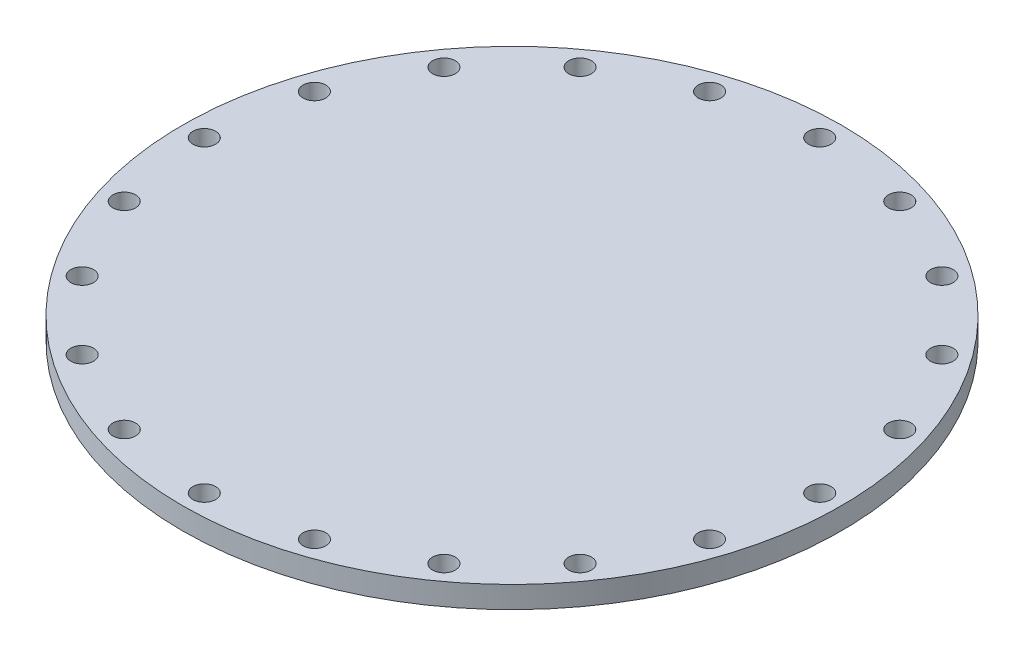
ISO-10303-21;
HEADER;
FILE_DESCRIPTION(('STEP AP214'),'2;1');
FILE_NAME('part.step','',(''),(''),'','','');
FILE_SCHEMA(('AUTOMOTIVE_DESIGN { 1 0 10303 214 1 1 1 1 }'));
ENDSEC;
DATA;
#1=APPLICATION_CONTEXT('core data for automotive mechanical design processes');
#2=APPLICATION_PROTOCOL_DEFINITION('international standard','automotive_design',2000,#1);
#3=PRODUCT_CONTEXT('',#1,'mechanical');
#4=PRODUCT('Part','Part','',(#3));
#5=PRODUCT_RELATED_PRODUCT_CATEGORY('part','',(#4));
#6=PRODUCT_DEFINITION_FORMATION('','',#4);
#7=PRODUCT_DEFINITION_CONTEXT('part definition',#1,'design');
#8=PRODUCT_DEFINITION('design','',#6,#7);
#9=PRODUCT_DEFINITION_SHAPE('','',#8);
#10=(LENGTH_UNIT() NAMED_UNIT(*) SI_UNIT(.MILLI.,.METRE.));
#11=(NAMED_UNIT(*) PLANE_ANGLE_UNIT() SI_UNIT($,.RADIAN.));
#12=(NAMED_UNIT(*) SI_UNIT($,.STERADIAN.) SOLID_ANGLE_UNIT());
#13=UNCERTAINTY_MEASURE_WITH_UNIT(LENGTH_MEASURE(1.E-05),#10,'distance_accuracy_value','');
#14=(GEOMETRIC_REPRESENTATION_CONTEXT(3) GLOBAL_UNCERTAINTY_ASSIGNED_CONTEXT((#13)) GLOBAL_UNIT_ASSIGNED_CONTEXT((#10,
#11,#12)) REPRESENTATION_CONTEXT('',''));
#15=CARTESIAN_POINT('',(0.,0.,0.));
#16=DIRECTION('',(0.,0.,1.));
#17=DIRECTION('',(1.,0.,0.));
#18=AXIS2_PLACEMENT_3D('',#15,#16,#17);
#19=CARTESIAN_POINT('',(0.,12.5,0.));
#20=DIRECTION('',(0.,1.,0.));
#21=DIRECTION('',(0.,0.,1.));
#22=AXIS2_PLACEMENT_3D('',#19,#20,#21);
#23=PLANE('',#22);
#24=CARTESIAN_POINT('',(-207.194301433094,12.5,-285.17849051716));
#25=DIRECTION('',(0.,1.,0.));
#26=DIRECTION('',(0.,0.,1.));
#27=AXIS2_PLACEMENT_3D('',#24,#25,#26);
#28=CIRCLE('',#27,13.0000000000098);
#29=CARTESIAN_POINT('',(-207.194301433094,12.5,-272.17849051715));
#30=VERTEX_POINT('',#29);
#31=EDGE_CURVE('E149',#30,#30,#28,.T.);
#32=ORIENTED_EDGE('',*,*,#31,.F.);
#33=EDGE_LOOP('',(#32));
#34=FACE_BOUND('',#33,.T.);
#35=CARTESIAN_POINT('',(-335.247421994031,12.5,-108.928490517155));
#36=DIRECTION('',(0.,1.,0.));
#37=DIRECTION('',(0.,0.,1.));
#38=AXIS2_PLACEMENT_3D('',#35,#36,#37);
#39=CIRCLE('',#38,13.0000000000179);
#40=CARTESIAN_POINT('',(-335.247421994031,12.5,-95.9284905171368));
#41=VERTEX_POINT('',#40);
#42=EDGE_CURVE('E137',#41,#41,#39,.T.);
#43=ORIENTED_EDGE('',*,*,#42,.F.);
#44=EDGE_LOOP('',(#43));
#45=FACE_BOUND('',#44,.T.);
#46=CARTESIAN_POINT('',(-335.247421994022,12.5,108.928490517183));
#47=DIRECTION('',(0.,1.,0.));
#48=DIRECTION('',(0.,0.,1.));
#49=AXIS2_PLACEMENT_3D('',#46,#47,#48);
#50=CIRCLE('',#49,13.0000000000261);
#51=CARTESIAN_POINT('',(-335.247421994022,12.5,121.928490517209));
#52=VERTEX_POINT('',#51);
#53=EDGE_CURVE('E125',#52,#52,#50,.T.);
#54=ORIENTED_EDGE('',*,*,#53,.F.);
#55=EDGE_LOOP('',(#54));
#56=FACE_BOUND('',#55,.T.);
#57=CARTESIAN_POINT('',(-207.19430143307,12.5,285.178490517178));
#58=DIRECTION('',(0.,1.,0.));
#59=DIRECTION('',(0.,0.,1.));
#60=AXIS2_PLACEMENT_3D('',#57,#58,#59);
#61=CIRCLE('',#60,13.0000000000314);
#62=CARTESIAN_POINT('',(-207.19430143307,12.5,298.178490517209));
#63=VERTEX_POINT('',#62);
#64=EDGE_CURVE('E113',#63,#63,#61,.T.);
#65=ORIENTED_EDGE('',*,*,#64,.F.);
#66=EDGE_LOOP('',(#65));
#67=FACE_BOUND('',#66,.T.);
#68=CARTESIAN_POINT('',(2.99264513236424E-11,12.5,352.5));
#69=DIRECTION('',(0.,1.,0.));
#70=DIRECTION('',(0.,0.,1.));
#71=AXIS2_PLACEMENT_3D('',#68,#69,#70);
#72=CIRCLE('',#71,13.000000000031);
#73=CARTESIAN_POINT('',(2.99264513236424E-11,12.5,365.500000000031));
#74=VERTEX_POINT('',#73);
#75=EDGE_CURVE('E101',#74,#74,#72,.T.);
#76=ORIENTED_EDGE('',*,*,#75,.F.);
#77=EDGE_LOOP('',(#76));
#78=FACE_BOUND('',#77,.T.);
#79=CARTESIAN_POINT('',(207.194301433124,12.5,285.17849051716));
#80=DIRECTION('',(0.,1.,0.));
#81=DIRECTION('',(0.,0.,1.));
#82=AXIS2_PLACEMENT_3D('',#79,#80,#81);
#83=CIRCLE('',#82,13.0000000000252);
#84=CARTESIAN_POINT('',(207.194301433124,12.5,298.178490517185));
#85=VERTEX_POINT('',#84);
#86=EDGE_CURVE('E89',#85,#85,#83,.T.);
#87=ORIENTED_EDGE('',*,*,#86,.F.);
#88=EDGE_LOOP('',(#87));
#89=FACE_BOUND('',#88,.T.);
#90=CARTESIAN_POINT('',(335.247421994061,12.5,108.928490517155));
#91=DIRECTION('',(0.,1.,0.));
#92=DIRECTION('',(0.,0.,1.));
#93=AXIS2_PLACEMENT_3D('',#90,#91,#92);
#94=CIRCLE('',#93,13.0000000000161);
#95=CARTESIAN_POINT('',(335.247421994061,12.5,121.928490517171));
#96=VERTEX_POINT('',#95);
#97=EDGE_CURVE('E77',#96,#96,#94,.T.);
#98=ORIENTED_EDGE('',*,*,#97,.F.);
#99=EDGE_LOOP('',(#98));
#100=FACE_BOUND('',#99,.T.);
#101=CARTESIAN_POINT('',(335.247421994052,12.5,-108.928490517183));
#102=DIRECTION('',(0.,1.,0.));
#103=DIRECTION('',(0.,0.,1.));
#104=AXIS2_PLACEMENT_3D('',#101,#102,#103);
#105=CIRCLE('',#104,13.0000000000067);
#106=CARTESIAN_POINT('',(335.247421994052,12.5,-95.9284905171764));
#107=VERTEX_POINT('',#106);
#108=EDGE_CURVE('E65',#107,#107,#105,.T.);
#109=ORIENTED_EDGE('',*,*,#108,.F.);
#110=EDGE_LOOP('',(#109));
#111=FACE_BOUND('',#110,.T.);
#112=CARTESIAN_POINT('',(207.1943014331,12.5,-285.178490517178));
#113=DIRECTION('',(0.,1.,0.));
#114=DIRECTION('',(0.,0.,1.));
#115=AXIS2_PLACEMENT_3D('',#112,#113,#114);
#116=CIRCLE('',#115,13.0000000000007);
#117=CARTESIAN_POINT('',(207.1943014331,12.5,-272.178490517177));
#118=VERTEX_POINT('',#117);
#119=EDGE_CURVE('E53',#118,#118,#116,.T.);
#120=ORIENTED_EDGE('',*,*,#119,.F.);
#121=EDGE_LOOP('',(#120));
#122=FACE_BOUND('',#121,.T.);
#123=CARTESIAN_POINT('',(0.,12.5,-352.5));
#124=DIRECTION('',(0.,1.,0.));
#125=DIRECTION('',(0.,0.,1.));
#126=AXIS2_PLACEMENT_3D('',#123,#124,#125);
#127=CIRCLE('',#126,13.);
#128=CARTESIAN_POINT('',(0.,12.5,-339.5));
#129=VERTEX_POINT('',#128);
#130=EDGE_CURVE('E42',#129,#129,#127,.T.);
#131=ORIENTED_EDGE('',*,*,#130,.F.);
#132=EDGE_LOOP('',(#131));
#133=FACE_BOUND('',#132,.T.);
#134=CARTESIAN_POINT('',(0.,12.5,0.));
#135=DIRECTION('',(0.,1.,0.));
#136=DIRECTION('',(0.,0.,1.));
#137=AXIS2_PLACEMENT_3D('',#134,#135,#136);
#138=CIRCLE('',#137,377.5);
#139=CARTESIAN_POINT('',(0.,12.5,377.5));
#140=VERTEX_POINT('',#139);
#141=EDGE_CURVE('E10',#140,#140,#138,.T.);
#142=ORIENTED_EDGE('',*,*,#141,.T.);
#143=EDGE_LOOP('',(#142));
#144=FACE_BOUND('',#143,.T.);
#145=CARTESIAN_POINT('',(108.928490517169,12.5,-335.247421994042));
#146=DIRECTION('',(0.,1.,0.));
#147=DIRECTION('',(0.,0.,1.));
#148=AXIS2_PLACEMENT_3D('',#145,#146,#147);
#149=CIRCLE('',#148,13.);
#150=CARTESIAN_POINT('',(108.928490517169,12.5,-322.247421994042));
#151=VERTEX_POINT('',#150);
#152=EDGE_CURVE('E47',#151,#151,#149,.T.);
#153=ORIENTED_EDGE('',*,*,#152,.F.);
#154=EDGE_LOOP('',(#153));
#155=FACE_BOUND('',#154,.T.);
#156=CARTESIAN_POINT('',(285.178490517175,12.5,-207.194301433109));
#157=DIRECTION('',(0.,1.,0.));
#158=DIRECTION('',(0.,0.,1.));
#159=AXIS2_PLACEMENT_3D('',#156,#157,#158);
#160=CIRCLE('',#159,13.0000000000031);
#161=CARTESIAN_POINT('',(285.178490517175,12.5,-194.194301433106));
#162=VERTEX_POINT('',#161);
#163=EDGE_CURVE('E59',#162,#162,#160,.T.);
#164=ORIENTED_EDGE('',*,*,#163,.F.);
#165=EDGE_LOOP('',(#164));
#166=FACE_BOUND('',#165,.T.);
#167=CARTESIAN_POINT('',(352.500000000015,12.5,-1.49632256618212E-11));
#168=DIRECTION('',(0.,1.,0.));
#169=DIRECTION('',(0.,0.,1.));
#170=AXIS2_PLACEMENT_3D('',#167,#168,#169);
#171=CIRCLE('',#170,13.0000000000111);
#172=CARTESIAN_POINT('',(352.500000000015,12.5,12.9999999999962));
#173=VERTEX_POINT('',#172);
#174=EDGE_CURVE('E71',#173,#173,#171,.T.);
#175=ORIENTED_EDGE('',*,*,#174,.F.);
#176=EDGE_LOOP('',(#175));
#177=FACE_BOUND('',#176,.T.);
#178=CARTESIAN_POINT('',(285.178490517193,12.5,207.194301433085));
#179=DIRECTION('',(0.,1.,0.));
#180=DIRECTION('',(0.,0.,1.));
#181=AXIS2_PLACEMENT_3D('',#178,#179,#180);
#182=CIRCLE('',#181,13.0000000000207);
#183=CARTESIAN_POINT('',(285.178490517193,12.5,220.194301433105));
#184=VERTEX_POINT('',#183);
#185=EDGE_CURVE('E83',#184,#184,#182,.T.);
#186=ORIENTED_EDGE('',*,*,#185,.F.);
#187=EDGE_LOOP('',(#186));
#188=FACE_BOUND('',#187,.T.);
#189=CARTESIAN_POINT('',(108.928490517198,12.5,335.247421994037));
#190=DIRECTION('',(0.,1.,0.));
#191=DIRECTION('',(0.,0.,1.));
#192=AXIS2_PLACEMENT_3D('',#189,#190,#191);
#193=CIRCLE('',#192,13.0000000000288);
#194=CARTESIAN_POINT('',(108.928490517198,12.5,348.247421994066));
#195=VERTEX_POINT('',#194);
#196=EDGE_CURVE('E95',#195,#195,#193,.T.);
#197=ORIENTED_EDGE('',*,*,#196,.F.);
#198=EDGE_LOOP('',(#197));
#199=FACE_BOUND('',#198,.T.);
#200=CARTESIAN_POINT('',(-108.92849051714,12.5,335.247421994046));
#201=DIRECTION('',(0.,1.,0.));
#202=DIRECTION('',(0.,0.,1.));
#203=AXIS2_PLACEMENT_3D('',#200,#201,#202);
#204=CIRCLE('',#203,13.0000000000319);
#205=CARTESIAN_POINT('',(-108.92849051714,12.5,348.247421994078));
#206=VERTEX_POINT('',#205);
#207=EDGE_CURVE('E107',#206,#206,#204,.T.);
#208=ORIENTED_EDGE('',*,*,#207,.F.);
#209=EDGE_LOOP('',(#208));
#210=FACE_BOUND('',#209,.T.);
#211=CARTESIAN_POINT('',(-285.178490517145,12.5,207.194301433109));
#212=DIRECTION('',(0.,1.,0.));
#213=DIRECTION('',(0.,0.,1.));
#214=AXIS2_PLACEMENT_3D('',#211,#212,#213);
#215=CIRCLE('',#214,13.0000000000296);
#216=CARTESIAN_POINT('',(-285.178490517145,12.5,220.194301433138));
#217=VERTEX_POINT('',#216);
#218=EDGE_CURVE('E119',#217,#217,#215,.T.);
#219=ORIENTED_EDGE('',*,*,#218,.F.);
#220=EDGE_LOOP('',(#219));
#221=FACE_BOUND('',#220,.T.);
#222=CARTESIAN_POINT('',(-352.499999999985,12.5,1.50063944614911E-11));
#223=DIRECTION('',(0.,1.,0.));
#224=DIRECTION('',(0.,0.,1.));
#225=AXIS2_PLACEMENT_3D('',#222,#223,#224);
#226=CIRCLE('',#225,13.0000000000223);
#227=CARTESIAN_POINT('',(-352.499999999985,12.5,13.0000000000373));
#228=VERTEX_POINT('',#227);
#229=EDGE_CURVE('E131',#228,#228,#226,.T.);
#230=ORIENTED_EDGE('',*,*,#229,.F.);
#231=EDGE_LOOP('',(#230));
#232=FACE_BOUND('',#231,.T.);
#233=CARTESIAN_POINT('',(-285.178490517163,12.5,-207.194301433085));
#234=DIRECTION('',(0.,1.,0.));
#235=DIRECTION('',(0.,0.,1.));
#236=AXIS2_PLACEMENT_3D('',#233,#234,#235);
#237=CIRCLE('',#236,13.0000000000136);
#238=CARTESIAN_POINT('',(-285.178490517163,12.5,-194.194301433071));
#239=VERTEX_POINT('',#238);
#240=EDGE_CURVE('E143',#239,#239,#237,.T.);
#241=ORIENTED_EDGE('',*,*,#240,.F.);
#242=EDGE_LOOP('',(#241));
#243=FACE_BOUND('',#242,.T.);
#244=CARTESIAN_POINT('',(-108.928490517165,12.5,-335.247421994043));
#245=DIRECTION('',(0.,1.,0.));
#246=DIRECTION('',(0.,0.,1.));
#247=AXIS2_PLACEMENT_3D('',#244,#245,#246);
#248=CIRCLE('',#247,13.);
#249=CARTESIAN_POINT('',(-108.928490517165,12.5,-322.247421994043));
#250=VERTEX_POINT('',#249);
#251=EDGE_CURVE('E155',#250,#250,#248,.T.);
#252=ORIENTED_EDGE('',*,*,#251,.F.);
#253=EDGE_LOOP('',(#252));
#254=FACE_BOUND('',#253,.T.);
#255=ADVANCED_FACE('F31',(#34,#45,#56,#67,#78,#89,#100,#111,#122,#133,#144,#155,#166,#177,#188,
#199,#210,#221,#232,#243,#254),#23,.T.);
#256=CARTESIAN_POINT('',(0.,-12.5,0.));
#257=DIRECTION('',(0.,1.,0.));
#258=DIRECTION('',(0.,0.,1.));
#259=AXIS2_PLACEMENT_3D('',#256,#257,#258);
#260=PLANE('',#259);
#261=CARTESIAN_POINT('',(0.,-12.5,0.));
#262=DIRECTION('',(0.,1.,0.));
#263=DIRECTION('',(0.,0.,1.));
#264=AXIS2_PLACEMENT_3D('',#261,#262,#263);
#265=CIRCLE('',#264,377.5);
#266=CARTESIAN_POINT('',(0.,-12.5,377.5));
#267=VERTEX_POINT('',#266);
#268=EDGE_CURVE('E35',#267,#267,#265,.T.);
#269=ORIENTED_EDGE('',*,*,#268,.F.);
#270=EDGE_LOOP('',(#269));
#271=FACE_BOUND('',#270,.T.);
#272=CARTESIAN_POINT('',(0.,-12.5,-352.5));
#273=DIRECTION('',(0.,1.,0.));
#274=DIRECTION('',(0.,0.,1.));
#275=AXIS2_PLACEMENT_3D('',#272,#273,#274);
#276=CIRCLE('',#275,13.);
#277=CARTESIAN_POINT('',(0.,-12.5,-339.5));
#278=VERTEX_POINT('',#277);
#279=EDGE_CURVE('E44',#278,#278,#276,.T.);
#280=ORIENTED_EDGE('',*,*,#279,.T.);
#281=EDGE_LOOP('',(#280));
#282=FACE_BOUND('',#281,.T.);
#283=CARTESIAN_POINT('',(108.928490517169,-12.5,-335.247421994042));
#284=DIRECTION('',(0.,1.,0.));
#285=DIRECTION('',(0.,0.,1.));
#286=AXIS2_PLACEMENT_3D('',#283,#284,#285);
#287=CIRCLE('',#286,13.);
#288=CARTESIAN_POINT('',(108.928490517169,-12.5,-322.247421994042));
#289=VERTEX_POINT('',#288);
#290=EDGE_CURVE('E50',#289,#289,#287,.T.);
#291=ORIENTED_EDGE('',*,*,#290,.T.);
#292=EDGE_LOOP('',(#291));
#293=FACE_BOUND('',#292,.T.);
#294=CARTESIAN_POINT('',(207.1943014331,-12.5,-285.178490517178));
#295=DIRECTION('',(0.,1.,0.));
#296=DIRECTION('',(0.,0.,1.));
#297=AXIS2_PLACEMENT_3D('',#294,#295,#296);
#298=CIRCLE('',#297,13.0000000000007);
#299=CARTESIAN_POINT('',(207.1943014331,-12.5,-272.178490517177));
#300=VERTEX_POINT('',#299);
#301=EDGE_CURVE('E56',#300,#300,#298,.T.);
#302=ORIENTED_EDGE('',*,*,#301,.T.);
#303=EDGE_LOOP('',(#302));
#304=FACE_BOUND('',#303,.T.);
#305=CARTESIAN_POINT('',(285.178490517175,-12.5,-207.194301433109));
#306=DIRECTION('',(0.,1.,0.));
#307=DIRECTION('',(0.,0.,1.));
#308=AXIS2_PLACEMENT_3D('',#305,#306,#307);
#309=CIRCLE('',#308,13.0000000000031);
#310=CARTESIAN_POINT('',(285.178490517175,-12.5,-194.194301433106));
#311=VERTEX_POINT('',#310);
#312=EDGE_CURVE('E62',#311,#311,#309,.T.);
#313=ORIENTED_EDGE('',*,*,#312,.T.);
#314=EDGE_LOOP('',(#313));
#315=FACE_BOUND('',#314,.T.);
#316=CARTESIAN_POINT('',(335.247421994052,-12.5,-108.928490517183));
#317=DIRECTION('',(0.,1.,0.));
#318=DIRECTION('',(0.,0.,1.));
#319=AXIS2_PLACEMENT_3D('',#316,#317,#318);
#320=CIRCLE('',#319,13.0000000000067);
#321=CARTESIAN_POINT('',(335.247421994052,-12.5,-95.9284905171764));
#322=VERTEX_POINT('',#321);
#323=EDGE_CURVE('E68',#322,#322,#320,.T.);
#324=ORIENTED_EDGE('',*,*,#323,.T.);
#325=EDGE_LOOP('',(#324));
#326=FACE_BOUND('',#325,.T.);
#327=CARTESIAN_POINT('',(352.500000000015,-12.5,-1.49632256618212E-11));
#328=DIRECTION('',(0.,1.,0.));
#329=DIRECTION('',(0.,0.,1.));
#330=AXIS2_PLACEMENT_3D('',#327,#328,#329);
#331=CIRCLE('',#330,13.0000000000111);
#332=CARTESIAN_POINT('',(352.500000000015,-12.5,12.9999999999962));
#333=VERTEX_POINT('',#332);
#334=EDGE_CURVE('E74',#333,#333,#331,.T.);
#335=ORIENTED_EDGE('',*,*,#334,.T.);
#336=EDGE_LOOP('',(#335));
#337=FACE_BOUND('',#336,.T.);
#338=CARTESIAN_POINT('',(335.247421994061,-12.5,108.928490517155));
#339=DIRECTION('',(0.,1.,0.));
#340=DIRECTION('',(0.,0.,1.));
#341=AXIS2_PLACEMENT_3D('',#338,#339,#340);
#342=CIRCLE('',#341,13.0000000000161);
#343=CARTESIAN_POINT('',(335.247421994061,-12.5,121.928490517171));
#344=VERTEX_POINT('',#343);
#345=EDGE_CURVE('E80',#344,#344,#342,.T.);
#346=ORIENTED_EDGE('',*,*,#345,.T.);
#347=EDGE_LOOP('',(#346));
#348=FACE_BOUND('',#347,.T.);
#349=CARTESIAN_POINT('',(285.178490517193,-12.5,207.194301433085));
#350=DIRECTION('',(0.,1.,0.));
#351=DIRECTION('',(0.,0.,1.));
#352=AXIS2_PLACEMENT_3D('',#349,#350,#351);
#353=CIRCLE('',#352,13.0000000000207);
#354=CARTESIAN_POINT('',(285.178490517193,-12.5,220.194301433105));
#355=VERTEX_POINT('',#354);
#356=EDGE_CURVE('E86',#355,#355,#353,.T.);
#357=ORIENTED_EDGE('',*,*,#356,.T.);
#358=EDGE_LOOP('',(#357));
#359=FACE_BOUND('',#358,.T.);
#360=CARTESIAN_POINT('',(207.194301433124,-12.5,285.17849051716));
#361=DIRECTION('',(0.,1.,0.));
#362=DIRECTION('',(0.,0.,1.));
#363=AXIS2_PLACEMENT_3D('',#360,#361,#362);
#364=CIRCLE('',#363,13.0000000000252);
#365=CARTESIAN_POINT('',(207.194301433124,-12.5,298.178490517185));
#366=VERTEX_POINT('',#365);
#367=EDGE_CURVE('E92',#366,#366,#364,.T.);
#368=ORIENTED_EDGE('',*,*,#367,.T.);
#369=EDGE_LOOP('',(#368));
#370=FACE_BOUND('',#369,.T.);
#371=CARTESIAN_POINT('',(108.928490517198,-12.5,335.247421994037));
#372=DIRECTION('',(0.,1.,0.));
#373=DIRECTION('',(0.,0.,1.));
#374=AXIS2_PLACEMENT_3D('',#371,#372,#373);
#375=CIRCLE('',#374,13.0000000000288);
#376=CARTESIAN_POINT('',(108.928490517198,-12.5,348.247421994066));
#377=VERTEX_POINT('',#376);
#378=EDGE_CURVE('E98',#377,#377,#375,.T.);
#379=ORIENTED_EDGE('',*,*,#378,.T.);
#380=EDGE_LOOP('',(#379));
#381=FACE_BOUND('',#380,.T.);
#382=CARTESIAN_POINT('',(2.99264513236424E-11,-12.5,352.5));
#383=DIRECTION('',(0.,1.,0.));
#384=DIRECTION('',(0.,0.,1.));
#385=AXIS2_PLACEMENT_3D('',#382,#383,#384);
#386=CIRCLE('',#385,13.000000000031);
#387=CARTESIAN_POINT('',(2.99264513236424E-11,-12.5,365.500000000031));
#388=VERTEX_POINT('',#387);
#389=EDGE_CURVE('E104',#388,#388,#386,.T.);
#390=ORIENTED_EDGE('',*,*,#389,.T.);
#391=EDGE_LOOP('',(#390));
#392=FACE_BOUND('',#391,.T.);
#393=CARTESIAN_POINT('',(-108.92849051714,-12.5,335.247421994046));
#394=DIRECTION('',(0.,1.,0.));
#395=DIRECTION('',(0.,0.,1.));
#396=AXIS2_PLACEMENT_3D('',#393,#394,#395);
#397=CIRCLE('',#396,13.0000000000319);
#398=CARTESIAN_POINT('',(-108.92849051714,-12.5,348.247421994078));
#399=VERTEX_POINT('',#398);
#400=EDGE_CURVE('E110',#399,#399,#397,.T.);
#401=ORIENTED_EDGE('',*,*,#400,.T.);
#402=EDGE_LOOP('',(#401));
#403=FACE_BOUND('',#402,.T.);
#404=CARTESIAN_POINT('',(-207.19430143307,-12.5,285.178490517178));
#405=DIRECTION('',(0.,1.,0.));
#406=DIRECTION('',(0.,0.,1.));
#407=AXIS2_PLACEMENT_3D('',#404,#405,#406);
#408=CIRCLE('',#407,13.0000000000314);
#409=CARTESIAN_POINT('',(-207.19430143307,-12.5,298.178490517209));
#410=VERTEX_POINT('',#409);
#411=EDGE_CURVE('E116',#410,#410,#408,.T.);
#412=ORIENTED_EDGE('',*,*,#411,.T.);
#413=EDGE_LOOP('',(#412));
#414=FACE_BOUND('',#413,.T.);
#415=CARTESIAN_POINT('',(-285.178490517145,-12.5,207.194301433109));
#416=DIRECTION('',(0.,1.,0.));
#417=DIRECTION('',(0.,0.,1.));
#418=AXIS2_PLACEMENT_3D('',#415,#416,#417);
#419=CIRCLE('',#418,13.0000000000296);
#420=CARTESIAN_POINT('',(-285.178490517145,-12.5,220.194301433138));
#421=VERTEX_POINT('',#420);
#422=EDGE_CURVE('E122',#421,#421,#419,.T.);
#423=ORIENTED_EDGE('',*,*,#422,.T.);
#424=EDGE_LOOP('',(#423));
#425=FACE_BOUND('',#424,.T.);
#426=CARTESIAN_POINT('',(-335.247421994022,-12.5,108.928490517183));
#427=DIRECTION('',(0.,1.,0.));
#428=DIRECTION('',(0.,0.,1.));
#429=AXIS2_PLACEMENT_3D('',#426,#427,#428);
#430=CIRCLE('',#429,13.0000000000261);
#431=CARTESIAN_POINT('',(-335.247421994022,-12.5,121.928490517209));
#432=VERTEX_POINT('',#431);
#433=EDGE_CURVE('E128',#432,#432,#430,.T.);
#434=ORIENTED_EDGE('',*,*,#433,.T.);
#435=EDGE_LOOP('',(#434));
#436=FACE_BOUND('',#435,.T.);
#437=CARTESIAN_POINT('',(-352.499999999985,-12.5,1.50063944614911E-11));
#438=DIRECTION('',(0.,1.,0.));
#439=DIRECTION('',(0.,0.,1.));
#440=AXIS2_PLACEMENT_3D('',#437,#438,#439);
#441=CIRCLE('',#440,13.0000000000223);
#442=CARTESIAN_POINT('',(-352.499999999985,-12.5,13.0000000000373));
#443=VERTEX_POINT('',#442);
#444=EDGE_CURVE('E134',#443,#443,#441,.T.);
#445=ORIENTED_EDGE('',*,*,#444,.T.);
#446=EDGE_LOOP('',(#445));
#447=FACE_BOUND('',#446,.T.);
#448=CARTESIAN_POINT('',(-335.247421994031,-12.5,-108.928490517155));
#449=DIRECTION('',(0.,1.,0.));
#450=DIRECTION('',(0.,0.,1.));
#451=AXIS2_PLACEMENT_3D('',#448,#449,#450);
#452=CIRCLE('',#451,13.0000000000179);
#453=CARTESIAN_POINT('',(-335.247421994031,-12.5,-95.9284905171368));
#454=VERTEX_POINT('',#453);
#455=EDGE_CURVE('E140',#454,#454,#452,.T.);
#456=ORIENTED_EDGE('',*,*,#455,.T.);
#457=EDGE_LOOP('',(#456));
#458=FACE_BOUND('',#457,.T.);
#459=CARTESIAN_POINT('',(-285.178490517163,-12.5,-207.194301433085));
#460=DIRECTION('',(0.,1.,0.));
#461=DIRECTION('',(0.,0.,1.));
#462=AXIS2_PLACEMENT_3D('',#459,#460,#461);
#463=CIRCLE('',#462,13.0000000000136);
#464=CARTESIAN_POINT('',(-285.178490517163,-12.5,-194.194301433071));
#465=VERTEX_POINT('',#464);
#466=EDGE_CURVE('E146',#465,#465,#463,.T.);
#467=ORIENTED_EDGE('',*,*,#466,.T.);
#468=EDGE_LOOP('',(#467));
#469=FACE_BOUND('',#468,.T.);
#470=CARTESIAN_POINT('',(-207.194301433094,-12.5,-285.17849051716));
#471=DIRECTION('',(0.,1.,0.));
#472=DIRECTION('',(0.,0.,1.));
#473=AXIS2_PLACEMENT_3D('',#470,#471,#472);
#474=CIRCLE('',#473,13.0000000000098);
#475=CARTESIAN_POINT('',(-207.194301433094,-12.5,-272.17849051715));
#476=VERTEX_POINT('',#475);
#477=EDGE_CURVE('E152',#476,#476,#474,.T.);
#478=ORIENTED_EDGE('',*,*,#477,.T.);
#479=EDGE_LOOP('',(#478));
#480=FACE_BOUND('',#479,.T.);
#481=CARTESIAN_POINT('',(-108.928490517165,-12.5,-335.247421994043));
#482=DIRECTION('',(0.,1.,0.));
#483=DIRECTION('',(0.,0.,1.));
#484=AXIS2_PLACEMENT_3D('',#481,#482,#483);
#485=CIRCLE('',#484,13.);
#486=CARTESIAN_POINT('',(-108.928490517165,-12.5,-322.247421994043));
#487=VERTEX_POINT('',#486);
#488=EDGE_CURVE('E158',#487,#487,#485,.T.);
#489=ORIENTED_EDGE('',*,*,#488,.T.);
#490=EDGE_LOOP('',(#489));
#491=FACE_BOUND('',#490,.T.);
#492=ADVANCED_FACE('F168',(#271,#282,#293,#304,#315,#326,#337,#348,#359,#370,#381,#392,#403,
#414,#425,#436,#447,#458,#469,#480,#491),#260,.F.);
#493=CARTESIAN_POINT('',(0.,12.5,0.));
#494=DIRECTION('',(0.,-1.,0.));
#495=DIRECTION('',(0.,0.,-1.));
#496=AXIS2_PLACEMENT_3D('',#493,#494,#495);
#497=CYLINDRICAL_SURFACE('',#496,377.5);
#498=ORIENTED_EDGE('',*,*,#141,.F.);
#499=EDGE_LOOP('',(#498));
#500=FACE_BOUND('',#499,.T.);
#501=ORIENTED_EDGE('',*,*,#268,.T.);
#502=EDGE_LOOP('',(#501));
#503=FACE_BOUND('',#502,.T.);
#504=ADVANCED_FACE('F33',(#500,#503),#497,.T.);
#505=CARTESIAN_POINT('',(0.,12.5,-352.5));
#506=DIRECTION('',(0.,-1.,0.));
#507=DIRECTION('',(0.,0.,-1.));
#508=AXIS2_PLACEMENT_3D('',#505,#506,#507);
#509=CYLINDRICAL_SURFACE('',#508,13.);
#510=ORIENTED_EDGE('',*,*,#130,.T.);
#511=EDGE_LOOP('',(#510));
#512=FACE_BOUND('',#511,.T.);
#513=ORIENTED_EDGE('',*,*,#279,.F.);
#514=EDGE_LOOP('',(#513));
#515=FACE_BOUND('',#514,.T.);
#516=ADVANCED_FACE('F178',(#512,#515),#509,.F.);
#517=CARTESIAN_POINT('',(108.928490517169,12.5,-335.247421994042));
#518=DIRECTION('',(0.,-1.,0.));
#519=DIRECTION('',(0.,0.,-1.));
#520=AXIS2_PLACEMENT_3D('',#517,#518,#519);
#521=CYLINDRICAL_SURFACE('',#520,13.);
#522=ORIENTED_EDGE('',*,*,#152,.T.);
#523=EDGE_LOOP('',(#522));
#524=FACE_BOUND('',#523,.T.);
#525=ORIENTED_EDGE('',*,*,#290,.F.);
#526=EDGE_LOOP('',(#525));
#527=FACE_BOUND('',#526,.T.);
#528=ADVANCED_FACE('F181',(#524,#527),#521,.F.);
#529=CARTESIAN_POINT('',(207.1943014331,12.5,-285.178490517178));
#530=DIRECTION('',(0.,-1.,0.));
#531=DIRECTION('',(0.,0.,-1.));
#532=AXIS2_PLACEMENT_3D('',#529,#530,#531);
#533=CYLINDRICAL_SURFACE('',#532,13.0000000000007);
#534=ORIENTED_EDGE('',*,*,#119,.T.);
#535=EDGE_LOOP('',(#534));
#536=FACE_BOUND('',#535,.T.);
#537=ORIENTED_EDGE('',*,*,#301,.F.);
#538=EDGE_LOOP('',(#537));
#539=FACE_BOUND('',#538,.T.);
#540=ADVANCED_FACE('F185',(#536,#539),#533,.F.);
#541=CARTESIAN_POINT('',(285.178490517175,12.5,-207.194301433109));
#542=DIRECTION('',(0.,-1.,0.));
#543=DIRECTION('',(0.,0.,-1.));
#544=AXIS2_PLACEMENT_3D('',#541,#542,#543);
#545=CYLINDRICAL_SURFACE('',#544,13.0000000000031);
#546=ORIENTED_EDGE('',*,*,#163,.T.);
#547=EDGE_LOOP('',(#546));
#548=FACE_BOUND('',#547,.T.);
#549=ORIENTED_EDGE('',*,*,#312,.F.);
#550=EDGE_LOOP('',(#549));
#551=FACE_BOUND('',#550,.T.);
#552=ADVANCED_FACE('F189',(#548,#551),#545,.F.);
#553=CARTESIAN_POINT('',(335.247421994052,12.5,-108.928490517183));
#554=DIRECTION('',(0.,-1.,0.));
#555=DIRECTION('',(0.,0.,-1.));
#556=AXIS2_PLACEMENT_3D('',#553,#554,#555);
#557=CYLINDRICAL_SURFACE('',#556,13.0000000000067);
#558=ORIENTED_EDGE('',*,*,#108,.T.);
#559=EDGE_LOOP('',(#558));
#560=FACE_BOUND('',#559,.T.);
#561=ORIENTED_EDGE('',*,*,#323,.F.);
#562=EDGE_LOOP('',(#561));
#563=FACE_BOUND('',#562,.T.);
#564=ADVANCED_FACE('F193',(#560,#563),#557,.F.);
#565=CARTESIAN_POINT('',(352.500000000015,12.5,-1.49632256618212E-11));
#566=DIRECTION('',(0.,-1.,0.));
#567=DIRECTION('',(0.,0.,-1.));
#568=AXIS2_PLACEMENT_3D('',#565,#566,#567);
#569=CYLINDRICAL_SURFACE('',#568,13.0000000000111);
#570=ORIENTED_EDGE('',*,*,#174,.T.);
#571=EDGE_LOOP('',(#570));
#572=FACE_BOUND('',#571,.T.);
#573=ORIENTED_EDGE('',*,*,#334,.F.);
#574=EDGE_LOOP('',(#573));
#575=FACE_BOUND('',#574,.T.);
#576=ADVANCED_FACE('F197',(#572,#575),#569,.F.);
#577=CARTESIAN_POINT('',(335.247421994061,12.5,108.928490517155));
#578=DIRECTION('',(0.,-1.,0.));
#579=DIRECTION('',(0.,0.,-1.));
#580=AXIS2_PLACEMENT_3D('',#577,#578,#579);
#581=CYLINDRICAL_SURFACE('',#580,13.0000000000161);
#582=ORIENTED_EDGE('',*,*,#97,.T.);
#583=EDGE_LOOP('',(#582));
#584=FACE_BOUND('',#583,.T.);
#585=ORIENTED_EDGE('',*,*,#345,.F.);
#586=EDGE_LOOP('',(#585));
#587=FACE_BOUND('',#586,.T.);
#588=ADVANCED_FACE('F201',(#584,#587),#581,.F.);
#589=CARTESIAN_POINT('',(285.178490517193,12.5,207.194301433085));
#590=DIRECTION('',(0.,-1.,0.));
#591=DIRECTION('',(0.,0.,-1.));
#592=AXIS2_PLACEMENT_3D('',#589,#590,#591);
#593=CYLINDRICAL_SURFACE('',#592,13.0000000000207);
#594=ORIENTED_EDGE('',*,*,#185,.T.);
#595=EDGE_LOOP('',(#594));
#596=FACE_BOUND('',#595,.T.);
#597=ORIENTED_EDGE('',*,*,#356,.F.);
#598=EDGE_LOOP('',(#597));
#599=FACE_BOUND('',#598,.T.);
#600=ADVANCED_FACE('F205',(#596,#599),#593,.F.);
#601=CARTESIAN_POINT('',(207.194301433124,12.5,285.17849051716));
#602=DIRECTION('',(0.,-1.,0.));
#603=DIRECTION('',(0.,0.,-1.));
#604=AXIS2_PLACEMENT_3D('',#601,#602,#603);
#605=CYLINDRICAL_SURFACE('',#604,13.0000000000252);
#606=ORIENTED_EDGE('',*,*,#86,.T.);
#607=EDGE_LOOP('',(#606));
#608=FACE_BOUND('',#607,.T.);
#609=ORIENTED_EDGE('',*,*,#367,.F.);
#610=EDGE_LOOP('',(#609));
#611=FACE_BOUND('',#610,.T.);
#612=ADVANCED_FACE('F209',(#608,#611),#605,.F.);
#613=CARTESIAN_POINT('',(108.928490517198,12.5,335.247421994037));
#614=DIRECTION('',(0.,-1.,0.));
#615=DIRECTION('',(0.,0.,-1.));
#616=AXIS2_PLACEMENT_3D('',#613,#614,#615);
#617=CYLINDRICAL_SURFACE('',#616,13.0000000000288);
#618=ORIENTED_EDGE('',*,*,#196,.T.);
#619=EDGE_LOOP('',(#618));
#620=FACE_BOUND('',#619,.T.);
#621=ORIENTED_EDGE('',*,*,#378,.F.);
#622=EDGE_LOOP('',(#621));
#623=FACE_BOUND('',#622,.T.);
#624=ADVANCED_FACE('F213',(#620,#623),#617,.F.);
#625=CARTESIAN_POINT('',(2.99264513236424E-11,12.5,352.5));
#626=DIRECTION('',(0.,-1.,0.));
#627=DIRECTION('',(0.,0.,-1.));
#628=AXIS2_PLACEMENT_3D('',#625,#626,#627);
#629=CYLINDRICAL_SURFACE('',#628,13.000000000031);
#630=ORIENTED_EDGE('',*,*,#75,.T.);
#631=EDGE_LOOP('',(#630));
#632=FACE_BOUND('',#631,.T.);
#633=ORIENTED_EDGE('',*,*,#389,.F.);
#634=EDGE_LOOP('',(#633));
#635=FACE_BOUND('',#634,.T.);
#636=ADVANCED_FACE('F217',(#632,#635),#629,.F.);
#637=CARTESIAN_POINT('',(-108.92849051714,12.5,335.247421994046));
#638=DIRECTION('',(0.,-1.,0.));
#639=DIRECTION('',(0.,0.,-1.));
#640=AXIS2_PLACEMENT_3D('',#637,#638,#639);
#641=CYLINDRICAL_SURFACE('',#640,13.0000000000319);
#642=ORIENTED_EDGE('',*,*,#207,.T.);
#643=EDGE_LOOP('',(#642));
#644=FACE_BOUND('',#643,.T.);
#645=ORIENTED_EDGE('',*,*,#400,.F.);
#646=EDGE_LOOP('',(#645));
#647=FACE_BOUND('',#646,.T.);
#648=ADVANCED_FACE('F221',(#644,#647),#641,.F.);
#649=CARTESIAN_POINT('',(-207.19430143307,12.5,285.178490517178));
#650=DIRECTION('',(0.,-1.,0.));
#651=DIRECTION('',(0.,0.,-1.));
#652=AXIS2_PLACEMENT_3D('',#649,#650,#651);
#653=CYLINDRICAL_SURFACE('',#652,13.0000000000314);
#654=ORIENTED_EDGE('',*,*,#64,.T.);
#655=EDGE_LOOP('',(#654));
#656=FACE_BOUND('',#655,.T.);
#657=ORIENTED_EDGE('',*,*,#411,.F.);
#658=EDGE_LOOP('',(#657));
#659=FACE_BOUND('',#658,.T.);
#660=ADVANCED_FACE('F225',(#656,#659),#653,.F.);
#661=CARTESIAN_POINT('',(-285.178490517145,12.5,207.194301433109));
#662=DIRECTION('',(0.,-1.,0.));
#663=DIRECTION('',(0.,0.,-1.));
#664=AXIS2_PLACEMENT_3D('',#661,#662,#663);
#665=CYLINDRICAL_SURFACE('',#664,13.0000000000296);
#666=ORIENTED_EDGE('',*,*,#218,.T.);
#667=EDGE_LOOP('',(#666));
#668=FACE_BOUND('',#667,.T.);
#669=ORIENTED_EDGE('',*,*,#422,.F.);
#670=EDGE_LOOP('',(#669));
#671=FACE_BOUND('',#670,.T.);
#672=ADVANCED_FACE('F229',(#668,#671),#665,.F.);
#673=CARTESIAN_POINT('',(-335.247421994022,12.5,108.928490517183));
#674=DIRECTION('',(0.,-1.,0.));
#675=DIRECTION('',(0.,0.,-1.));
#676=AXIS2_PLACEMENT_3D('',#673,#674,#675);
#677=CYLINDRICAL_SURFACE('',#676,13.0000000000261);
#678=ORIENTED_EDGE('',*,*,#53,.T.);
#679=EDGE_LOOP('',(#678));
#680=FACE_BOUND('',#679,.T.);
#681=ORIENTED_EDGE('',*,*,#433,.F.);
#682=EDGE_LOOP('',(#681));
#683=FACE_BOUND('',#682,.T.);
#684=ADVANCED_FACE('F233',(#680,#683),#677,.F.);
#685=CARTESIAN_POINT('',(-352.499999999985,12.5,1.50063944614911E-11));
#686=DIRECTION('',(0.,-1.,0.));
#687=DIRECTION('',(0.,0.,-1.));
#688=AXIS2_PLACEMENT_3D('',#685,#686,#687);
#689=CYLINDRICAL_SURFACE('',#688,13.0000000000223);
#690=ORIENTED_EDGE('',*,*,#229,.T.);
#691=EDGE_LOOP('',(#690));
#692=FACE_BOUND('',#691,.T.);
#693=ORIENTED_EDGE('',*,*,#444,.F.);
#694=EDGE_LOOP('',(#693));
#695=FACE_BOUND('',#694,.T.);
#696=ADVANCED_FACE('F237',(#692,#695),#689,.F.);
#697=CARTESIAN_POINT('',(-335.247421994031,12.5,-108.928490517155));
#698=DIRECTION('',(0.,-1.,0.));
#699=DIRECTION('',(0.,0.,-1.));
#700=AXIS2_PLACEMENT_3D('',#697,#698,#699);
#701=CYLINDRICAL_SURFACE('',#700,13.0000000000179);
#702=ORIENTED_EDGE('',*,*,#42,.T.);
#703=EDGE_LOOP('',(#702));
#704=FACE_BOUND('',#703,.T.);
#705=ORIENTED_EDGE('',*,*,#455,.F.);
#706=EDGE_LOOP('',(#705));
#707=FACE_BOUND('',#706,.T.);
#708=ADVANCED_FACE('F241',(#704,#707),#701,.F.);
#709=CARTESIAN_POINT('',(-285.178490517163,12.5,-207.194301433085));
#710=DIRECTION('',(0.,-1.,0.));
#711=DIRECTION('',(0.,0.,-1.));
#712=AXIS2_PLACEMENT_3D('',#709,#710,#711);
#713=CYLINDRICAL_SURFACE('',#712,13.0000000000136);
#714=ORIENTED_EDGE('',*,*,#240,.T.);
#715=EDGE_LOOP('',(#714));
#716=FACE_BOUND('',#715,.T.);
#717=ORIENTED_EDGE('',*,*,#466,.F.);
#718=EDGE_LOOP('',(#717));
#719=FACE_BOUND('',#718,.T.);
#720=ADVANCED_FACE('F245',(#716,#719),#713,.F.);
#721=CARTESIAN_POINT('',(-207.194301433094,12.5,-285.17849051716));
#722=DIRECTION('',(0.,-1.,0.));
#723=DIRECTION('',(0.,0.,-1.));
#724=AXIS2_PLACEMENT_3D('',#721,#722,#723);
#725=CYLINDRICAL_SURFACE('',#724,13.0000000000098);
#726=ORIENTED_EDGE('',*,*,#31,.T.);
#727=EDGE_LOOP('',(#726));
#728=FACE_BOUND('',#727,.T.);
#729=ORIENTED_EDGE('',*,*,#477,.F.);
#730=EDGE_LOOP('',(#729));
#731=FACE_BOUND('',#730,.T.);
#732=ADVANCED_FACE('F249',(#728,#731),#725,.F.);
#733=CARTESIAN_POINT('',(-108.928490517165,12.5,-335.247421994043));
#734=DIRECTION('',(0.,-1.,0.));
#735=DIRECTION('',(0.,0.,-1.));
#736=AXIS2_PLACEMENT_3D('',#733,#734,#735);
#737=CYLINDRICAL_SURFACE('',#736,13.);
#738=ORIENTED_EDGE('',*,*,#251,.T.);
#739=EDGE_LOOP('',(#738));
#740=FACE_BOUND('',#739,.T.);
#741=ORIENTED_EDGE('',*,*,#488,.F.);
#742=EDGE_LOOP('',(#741));
#743=FACE_BOUND('',#742,.T.);
#744=ADVANCED_FACE('F164',(#740,#743),#737,.F.);
#745=CLOSED_SHELL('',(#255,#492,#504,#516,#528,#540,#552,#564,#576,#588,#600,#612,#624,#636,
#648,#660,#672,#684,#696,#708,#720,#732,#744));
#746=MANIFOLD_SOLID_BREP('B2',#745);
#747=ADVANCED_BREP_SHAPE_REPRESENTATION('',(#18,#746),#14);
#748=SHAPE_DEFINITION_REPRESENTATION(#9,#747);
ENDSEC;
END-ISO-10303-21;
